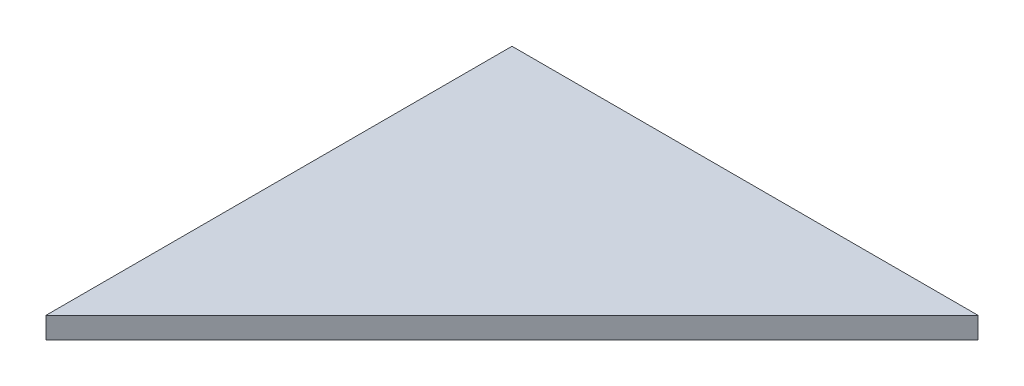
ISO-10303-21;
HEADER;
FILE_DESCRIPTION(('STEP AP214'),'2;1');
FILE_NAME('part.step','',(''),(''),'','','');
FILE_SCHEMA(('AUTOMOTIVE_DESIGN { 1 0 10303 214 1 1 1 1 }'));
ENDSEC;
DATA;
#1=APPLICATION_CONTEXT('core data for automotive mechanical design processes');
#2=APPLICATION_PROTOCOL_DEFINITION('international standard','automotive_design',2000,#1);
#3=PRODUCT_CONTEXT('',#1,'mechanical');
#4=PRODUCT('Part','Part','',(#3));
#5=PRODUCT_RELATED_PRODUCT_CATEGORY('part','',(#4));
#6=PRODUCT_DEFINITION_FORMATION('','',#4);
#7=PRODUCT_DEFINITION_CONTEXT('part definition',#1,'design');
#8=PRODUCT_DEFINITION('design','',#6,#7);
#9=PRODUCT_DEFINITION_SHAPE('','',#8);
#10=(LENGTH_UNIT() NAMED_UNIT(*) SI_UNIT(.MILLI.,.METRE.));
#11=(NAMED_UNIT(*) PLANE_ANGLE_UNIT() SI_UNIT($,.RADIAN.));
#12=(NAMED_UNIT(*) SI_UNIT($,.STERADIAN.) SOLID_ANGLE_UNIT());
#13=UNCERTAINTY_MEASURE_WITH_UNIT(LENGTH_MEASURE(1.E-05),#10,'distance_accuracy_value','');
#14=(GEOMETRIC_REPRESENTATION_CONTEXT(3) GLOBAL_UNCERTAINTY_ASSIGNED_CONTEXT((#13)) GLOBAL_UNIT_ASSIGNED_CONTEXT((#10,
#11,#12)) REPRESENTATION_CONTEXT('',''));
#15=CARTESIAN_POINT('',(0.,0.,0.));
#16=DIRECTION('',(0.,0.,1.));
#17=DIRECTION('',(1.,0.,0.));
#18=AXIS2_PLACEMENT_3D('',#15,#16,#17);
#19=CARTESIAN_POINT('',(0.,0.,0.));
#20=DIRECTION('',(0.,-1.,0.));
#21=DIRECTION('',(0.,0.,-1.));
#22=AXIS2_PLACEMENT_3D('',#19,#20,#21);
#23=PLANE('',#22);
#24=DIRECTION('',(-1.,0.,0.));
#25=VECTOR('',#24,1.);
#26=CARTESIAN_POINT('',(0.,0.,-69.85));
#27=LINE('',#26,#25);
#28=CARTESIAN_POINT('',(69.85,0.,-69.85));
#29=VERTEX_POINT('',#28);
#30=CARTESIAN_POINT('',(0.,0.,-69.85));
#31=VERTEX_POINT('',#30);
#32=EDGE_CURVE('E75',#29,#31,#27,.T.);
#33=ORIENTED_EDGE('',*,*,#32,.F.);
#34=DIRECTION('',(-0.707106781186548,0.,0.707106781186548));
#35=VECTOR('',#34,1.);
#36=CARTESIAN_POINT('',(0.,0.,0.));
#37=LINE('',#36,#35);
#38=CARTESIAN_POINT('',(0.,0.,0.));
#39=VERTEX_POINT('',#38);
#40=EDGE_CURVE('E63',#29,#39,#37,.T.);
#41=ORIENTED_EDGE('',*,*,#40,.T.);
#42=DIRECTION('',(0.,0.,1.));
#43=VECTOR('',#42,1.);
#44=CARTESIAN_POINT('',(0.,0.,0.));
#45=LINE('',#44,#43);
#46=EDGE_CURVE('E79',#31,#39,#45,.T.);
#47=ORIENTED_EDGE('',*,*,#46,.F.);
#48=EDGE_LOOP('',(#33,#41,#47));
#49=FACE_BOUND('',#48,.T.);
#50=ADVANCED_FACE('F33',(#49),#23,.T.);
#51=CARTESIAN_POINT('',(0.,3.175,0.));
#52=DIRECTION('',(1.,0.,0.));
#53=DIRECTION('',(0.,0.,-1.));
#54=AXIS2_PLACEMENT_3D('',#51,#52,#53);
#55=PLANE('',#54);
#56=ORIENTED_EDGE('',*,*,#46,.T.);
#57=DIRECTION('',(0.,-1.,0.));
#58=VECTOR('',#57,1.);
#59=CARTESIAN_POINT('',(0.,3.175,0.));
#60=LINE('',#59,#58);
#61=CARTESIAN_POINT('',(0.,3.17500000000001,0.));
#62=VERTEX_POINT('',#61);
#63=EDGE_CURVE('E11',#62,#39,#60,.T.);
#64=ORIENTED_EDGE('',*,*,#63,.F.);
#65=DIRECTION('',(0.,0.,1.));
#66=VECTOR('',#65,1.);
#67=CARTESIAN_POINT('',(0.,3.175,0.));
#68=LINE('',#67,#66);
#69=CARTESIAN_POINT('',(0.,3.175,-69.85));
#70=VERTEX_POINT('',#69);
#71=EDGE_CURVE('E71',#70,#62,#68,.T.);
#72=ORIENTED_EDGE('',*,*,#71,.F.);
#73=DIRECTION('',(0.,-1.,0.));
#74=VECTOR('',#73,1.);
#75=CARTESIAN_POINT('',(0.,3.175,-69.85));
#76=LINE('',#75,#74);
#77=EDGE_CURVE('E80',#70,#31,#76,.T.);
#78=ORIENTED_EDGE('',*,*,#77,.T.);
#79=EDGE_LOOP('',(#56,#64,#72,#78));
#80=FACE_BOUND('',#79,.T.);
#81=ADVANCED_FACE('F35',(#80),#55,.F.);
#82=CARTESIAN_POINT('',(0.,3.175,-69.85));
#83=DIRECTION('',(0.,0.,1.));
#84=DIRECTION('',(1.,0.,0.));
#85=AXIS2_PLACEMENT_3D('',#82,#83,#84);
#86=PLANE('',#85);
#87=ORIENTED_EDGE('',*,*,#32,.T.);
#88=ORIENTED_EDGE('',*,*,#77,.F.);
#89=DIRECTION('',(-1.,0.,0.));
#90=VECTOR('',#89,1.);
#91=CARTESIAN_POINT('',(0.,3.175,-69.85));
#92=LINE('',#91,#90);
#93=CARTESIAN_POINT('',(69.85,3.17500000000001,-69.85));
#94=VERTEX_POINT('',#93);
#95=EDGE_CURVE('E49',#94,#70,#92,.T.);
#96=ORIENTED_EDGE('',*,*,#95,.F.);
#97=DIRECTION('',(0.,-1.,0.));
#98=VECTOR('',#97,1.);
#99=CARTESIAN_POINT('',(69.85,3.175,-69.85));
#100=LINE('',#99,#98);
#101=EDGE_CURVE('E42',#94,#29,#100,.T.);
#102=ORIENTED_EDGE('',*,*,#101,.T.);
#103=EDGE_LOOP('',(#87,#88,#96,#102));
#104=FACE_BOUND('',#103,.T.);
#105=ADVANCED_FACE('F89',(#104),#86,.F.);
#106=CARTESIAN_POINT('',(0.,3.175,0.));
#107=DIRECTION('',(0.,-1.,0.));
#108=DIRECTION('',(0.,0.,-1.));
#109=AXIS2_PLACEMENT_3D('',#106,#107,#108);
#110=PLANE('',#109);
#111=ORIENTED_EDGE('',*,*,#71,.T.);
#112=DIRECTION('',(-0.707106781186548,0.,0.707106781186548));
#113=VECTOR('',#112,1.);
#114=CARTESIAN_POINT('',(0.,3.17500000000001,0.));
#115=LINE('',#114,#113);
#116=EDGE_CURVE('E67',#94,#62,#115,.T.);
#117=ORIENTED_EDGE('',*,*,#116,.F.);
#118=ORIENTED_EDGE('',*,*,#95,.T.);
#119=EDGE_LOOP('',(#111,#117,#118));
#120=FACE_BOUND('',#119,.T.);
#121=ADVANCED_FACE('F72',(#120),#110,.F.);
#122=CARTESIAN_POINT('',(0.,130.68603542917,0.));
#123=DIRECTION('',(-0.707106781186547,0.,-0.707106781186547));
#124=DIRECTION('',(-0.707106781186548,0.,0.707106781186548));
#125=AXIS2_PLACEMENT_3D('',#122,#123,#124);
#126=PLANE('',#125);
#127=ORIENTED_EDGE('',*,*,#116,.T.);
#128=ORIENTED_EDGE('',*,*,#63,.T.);
#129=ORIENTED_EDGE('',*,*,#40,.F.);
#130=ORIENTED_EDGE('',*,*,#101,.F.);
#131=EDGE_LOOP('',(#127,#128,#129,#130));
#132=FACE_BOUND('',#131,.T.);
#133=ADVANCED_FACE('F68',(#132),#126,.F.);
#134=CLOSED_SHELL('',(#50,#81,#105,#121,#133));
#135=MANIFOLD_SOLID_BREP('B2',#134);
#136=ADVANCED_BREP_SHAPE_REPRESENTATION('',(#18,#135),#14);
#137=SHAPE_DEFINITION_REPRESENTATION(#9,#136);
ENDSEC;
END-ISO-10303-21;
